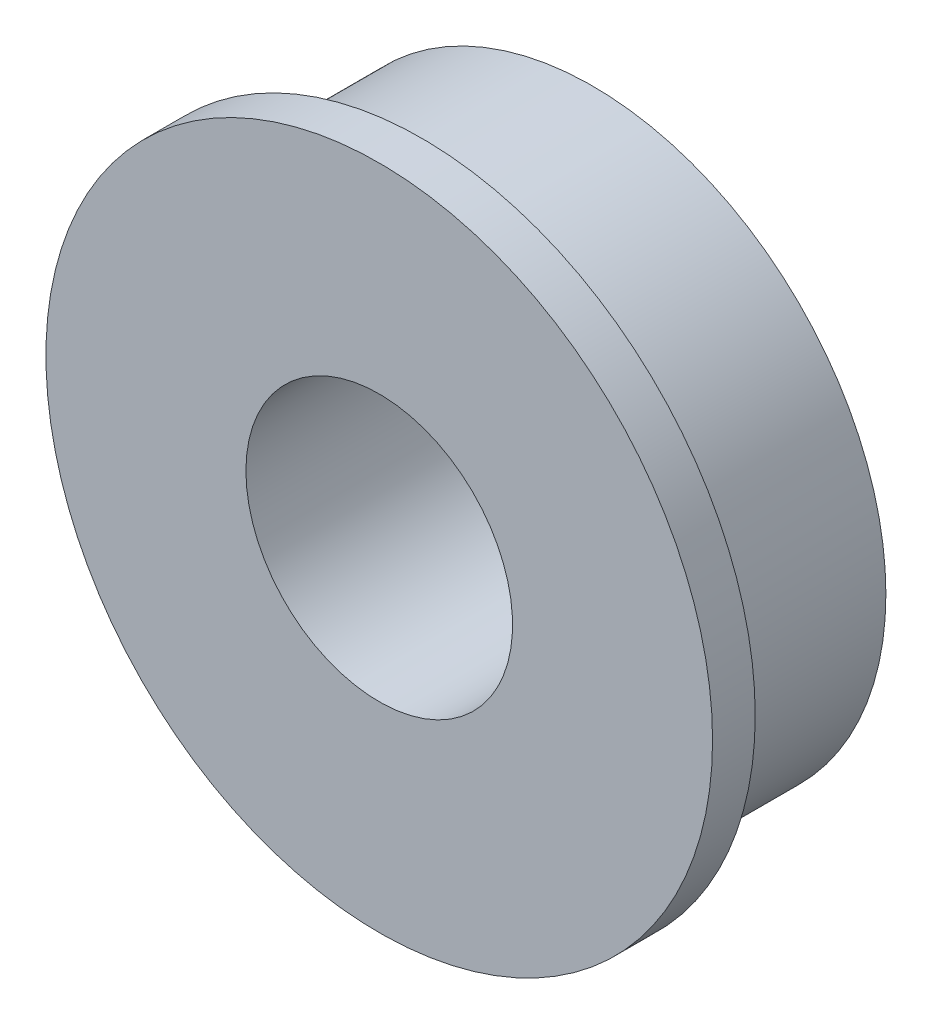
ISO-10303-21;
HEADER;
FILE_DESCRIPTION(('STEP AP214'),'2;1');
FILE_NAME('part.step','',(''),(''),'','','');
FILE_SCHEMA(('AUTOMOTIVE_DESIGN { 1 0 10303 214 1 1 1 1 }'));
ENDSEC;
DATA;
#1=APPLICATION_CONTEXT('core data for automotive mechanical design processes');
#2=APPLICATION_PROTOCOL_DEFINITION('international standard','automotive_design',2000,#1);
#3=PRODUCT_CONTEXT('',#1,'mechanical');
#4=PRODUCT('Part','Part','',(#3));
#5=PRODUCT_RELATED_PRODUCT_CATEGORY('part','',(#4));
#6=PRODUCT_DEFINITION_FORMATION('','',#4);
#7=PRODUCT_DEFINITION_CONTEXT('part definition',#1,'design');
#8=PRODUCT_DEFINITION('design','',#6,#7);
#9=PRODUCT_DEFINITION_SHAPE('','',#8);
#10=(LENGTH_UNIT() NAMED_UNIT(*) SI_UNIT(.MILLI.,.METRE.));
#11=(NAMED_UNIT(*) PLANE_ANGLE_UNIT() SI_UNIT($,.RADIAN.));
#12=(NAMED_UNIT(*) SI_UNIT($,.STERADIAN.) SOLID_ANGLE_UNIT());
#13=UNCERTAINTY_MEASURE_WITH_UNIT(LENGTH_MEASURE(1.E-05),#10,'distance_accuracy_value','');
#14=(GEOMETRIC_REPRESENTATION_CONTEXT(3) GLOBAL_UNCERTAINTY_ASSIGNED_CONTEXT((#13)) GLOBAL_UNIT_ASSIGNED_CONTEXT((#10,
#11,#12)) REPRESENTATION_CONTEXT('',''));
#15=CARTESIAN_POINT('',(0.,0.,0.));
#16=DIRECTION('',(0.,0.,1.));
#17=DIRECTION('',(1.,0.,0.));
#18=AXIS2_PLACEMENT_3D('',#15,#16,#17);
#19=CARTESIAN_POINT('',(0.,0.,4.));
#20=DIRECTION('',(0.,0.,-1.));
#21=DIRECTION('',(-1.,0.,0.));
#22=AXIS2_PLACEMENT_3D('',#19,#20,#21);
#23=CYLINDRICAL_SURFACE('',#22,5.50000000000006);
#24=CARTESIAN_POINT('',(0.,0.,0.));
#25=DIRECTION('',(0.,0.,1.));
#26=DIRECTION('',(1.,0.,0.));
#27=AXIS2_PLACEMENT_3D('',#24,#25,#26);
#28=CIRCLE('',#27,5.50000000000006);
#29=CARTESIAN_POINT('',(5.50000000000006,0.,0.));
#30=VERTEX_POINT('',#29);
#31=EDGE_CURVE('E37',#30,#30,#28,.T.);
#32=ORIENTED_EDGE('',*,*,#31,.T.);
#33=EDGE_LOOP('',(#32));
#34=FACE_BOUND('',#33,.T.);
#35=CARTESIAN_POINT('',(0.,0.,3.2));
#36=DIRECTION('',(0.,0.,1.));
#37=DIRECTION('',(1.,0.,0.));
#38=AXIS2_PLACEMENT_3D('',#35,#36,#37);
#39=CIRCLE('',#38,5.50000000000006);
#40=CARTESIAN_POINT('',(5.50000000000006,0.,3.2));
#41=VERTEX_POINT('',#40);
#42=EDGE_CURVE('E10',#41,#41,#39,.T.);
#43=ORIENTED_EDGE('',*,*,#42,.F.);
#44=EDGE_LOOP('',(#43));
#45=FACE_BOUND('',#44,.T.);
#46=ADVANCED_FACE('F31',(#34,#45),#23,.T.);
#47=CARTESIAN_POINT('',(0.,0.,0.));
#48=DIRECTION('',(0.,0.,1.));
#49=DIRECTION('',(1.,0.,0.));
#50=AXIS2_PLACEMENT_3D('',#47,#48,#49);
#51=PLANE('',#50);
#52=CARTESIAN_POINT('',(0.,0.,0.));
#53=DIRECTION('',(0.,0.,-1.));
#54=DIRECTION('',(-1.,0.,0.));
#55=AXIS2_PLACEMENT_3D('',#52,#53,#54);
#56=CIRCLE('',#55,2.5);
#57=CARTESIAN_POINT('',(-2.5,0.,0.));
#58=VERTEX_POINT('',#57);
#59=EDGE_CURVE('E51',#58,#58,#56,.T.);
#60=ORIENTED_EDGE('',*,*,#59,.F.);
#61=EDGE_LOOP('',(#60));
#62=FACE_BOUND('',#61,.T.);
#63=ORIENTED_EDGE('',*,*,#31,.F.);
#64=EDGE_LOOP('',(#63));
#65=FACE_BOUND('',#64,.T.);
#66=ADVANCED_FACE('F66',(#62,#65),#51,.F.);
#67=CARTESIAN_POINT('',(0.,0.,3.2));
#68=DIRECTION('',(0.,0.,1.));
#69=DIRECTION('',(1.,0.,0.));
#70=AXIS2_PLACEMENT_3D('',#67,#68,#69);
#71=CYLINDRICAL_SURFACE('',#70,6.25);
#72=CARTESIAN_POINT('',(0.,0.,3.2));
#73=DIRECTION('',(0.,0.,1.));
#74=DIRECTION('',(1.,0.,0.));
#75=AXIS2_PLACEMENT_3D('',#72,#73,#74);
#76=CIRCLE('',#75,6.25);
#77=CARTESIAN_POINT('',(6.25,0.,3.2));
#78=VERTEX_POINT('',#77);
#79=EDGE_CURVE('E41',#78,#78,#76,.T.);
#80=ORIENTED_EDGE('',*,*,#79,.T.);
#81=EDGE_LOOP('',(#80));
#82=FACE_BOUND('',#81,.T.);
#83=CARTESIAN_POINT('',(0.,0.,4.));
#84=DIRECTION('',(0.,0.,1.));
#85=DIRECTION('',(1.,0.,0.));
#86=AXIS2_PLACEMENT_3D('',#83,#84,#85);
#87=CIRCLE('',#86,6.25);
#88=CARTESIAN_POINT('',(6.25,0.,4.));
#89=VERTEX_POINT('',#88);
#90=EDGE_CURVE('E45',#89,#89,#87,.T.);
#91=ORIENTED_EDGE('',*,*,#90,.F.);
#92=EDGE_LOOP('',(#91));
#93=FACE_BOUND('',#92,.T.);
#94=ADVANCED_FACE('F69',(#82,#93),#71,.T.);
#95=CARTESIAN_POINT('',(0.,0.,3.2));
#96=DIRECTION('',(0.,0.,1.));
#97=DIRECTION('',(1.,0.,0.));
#98=AXIS2_PLACEMENT_3D('',#95,#96,#97);
#99=PLANE('',#98);
#100=ORIENTED_EDGE('',*,*,#42,.T.);
#101=EDGE_LOOP('',(#100));
#102=FACE_BOUND('',#101,.T.);
#103=ORIENTED_EDGE('',*,*,#79,.F.);
#104=EDGE_LOOP('',(#103));
#105=FACE_BOUND('',#104,.T.);
#106=ADVANCED_FACE('F74',(#102,#105),#99,.F.);
#107=CARTESIAN_POINT('',(0.,0.,4.));
#108=DIRECTION('',(0.,0.,1.));
#109=DIRECTION('',(1.,0.,0.));
#110=AXIS2_PLACEMENT_3D('',#107,#108,#109);
#111=PLANE('',#110);
#112=CARTESIAN_POINT('',(0.,0.,4.));
#113=DIRECTION('',(0.,0.,-1.));
#114=DIRECTION('',(-1.,0.,0.));
#115=AXIS2_PLACEMENT_3D('',#112,#113,#114);
#116=CIRCLE('',#115,2.5);
#117=CARTESIAN_POINT('',(-2.5,0.,4.));
#118=VERTEX_POINT('',#117);
#119=EDGE_CURVE('E49',#118,#118,#116,.T.);
#120=ORIENTED_EDGE('',*,*,#119,.T.);
#121=EDGE_LOOP('',(#120));
#122=FACE_BOUND('',#121,.T.);
#123=ORIENTED_EDGE('',*,*,#90,.T.);
#124=EDGE_LOOP('',(#123));
#125=FACE_BOUND('',#124,.T.);
#126=ADVANCED_FACE('F57',(#122,#125),#111,.T.);
#127=CARTESIAN_POINT('',(0.,0.,4.));
#128=DIRECTION('',(0.,0.,-1.));
#129=DIRECTION('',(-1.,0.,0.));
#130=AXIS2_PLACEMENT_3D('',#127,#128,#129);
#131=CYLINDRICAL_SURFACE('',#130,2.5);
#132=ORIENTED_EDGE('',*,*,#119,.F.);
#133=EDGE_LOOP('',(#132));
#134=FACE_BOUND('',#133,.T.);
#135=ORIENTED_EDGE('',*,*,#59,.T.);
#136=EDGE_LOOP('',(#135));
#137=FACE_BOUND('',#136,.T.);
#138=ADVANCED_FACE('F60',(#134,#137),#131,.F.);
#139=CLOSED_SHELL('',(#46,#66,#94,#106,#126,#138));
#140=MANIFOLD_SOLID_BREP('B2',#139);
#141=ADVANCED_BREP_SHAPE_REPRESENTATION('',(#18,#140),#14);
#142=SHAPE_DEFINITION_REPRESENTATION(#9,#141);
ENDSEC;
END-ISO-10303-21;
